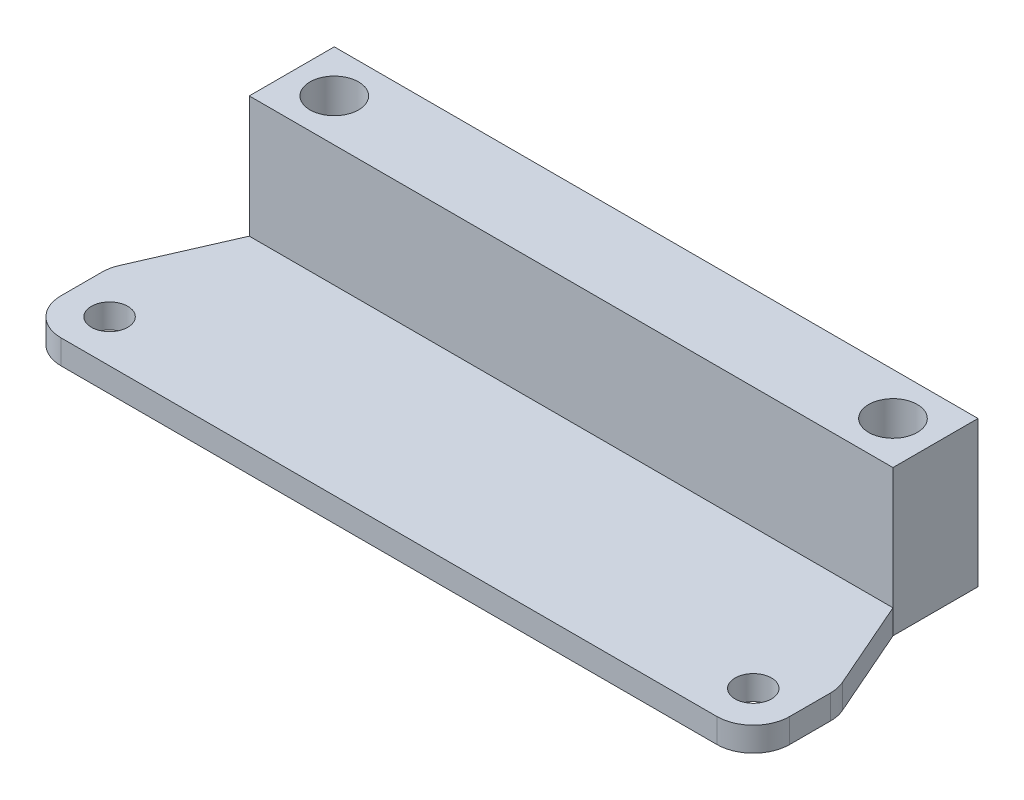
ISO-10303-21;
HEADER;
FILE_DESCRIPTION(('STEP AP214'),'2;1');
FILE_NAME('part.step','',(''),(''),'','','');
FILE_SCHEMA(('AUTOMOTIVE_DESIGN { 1 0 10303 214 1 1 1 1 }'));
ENDSEC;
DATA;
#1=APPLICATION_CONTEXT('core data for automotive mechanical design processes');
#2=APPLICATION_PROTOCOL_DEFINITION('international standard','automotive_design',2000,#1);
#3=PRODUCT_CONTEXT('',#1,'mechanical');
#4=PRODUCT('Part','Part','',(#3));
#5=PRODUCT_RELATED_PRODUCT_CATEGORY('part','',(#4));
#6=PRODUCT_DEFINITION_FORMATION('','',#4);
#7=PRODUCT_DEFINITION_CONTEXT('part definition',#1,'design');
#8=PRODUCT_DEFINITION('design','',#6,#7);
#9=PRODUCT_DEFINITION_SHAPE('','',#8);
#10=(LENGTH_UNIT() NAMED_UNIT(*) SI_UNIT(.MILLI.,.METRE.));
#11=(NAMED_UNIT(*) PLANE_ANGLE_UNIT() SI_UNIT($,.RADIAN.));
#12=(NAMED_UNIT(*) SI_UNIT($,.STERADIAN.) SOLID_ANGLE_UNIT());
#13=UNCERTAINTY_MEASURE_WITH_UNIT(LENGTH_MEASURE(1.E-05),#10,'distance_accuracy_value','');
#14=(GEOMETRIC_REPRESENTATION_CONTEXT(3) GLOBAL_UNCERTAINTY_ASSIGNED_CONTEXT((#13)) GLOBAL_UNIT_ASSIGNED_CONTEXT((#10,
#11,#12)) REPRESENTATION_CONTEXT('',''));
#15=CARTESIAN_POINT('',(0.,0.,0.));
#16=DIRECTION('',(0.,0.,1.));
#17=DIRECTION('',(1.,0.,0.));
#18=AXIS2_PLACEMENT_3D('',#15,#16,#17);
#19=CARTESIAN_POINT('',(3.49999999999999,2.,0.));
#20=DIRECTION('',(-1.,0.,0.));
#21=DIRECTION('',(0.,0.,1.));
#22=AXIS2_PLACEMENT_3D('',#19,#20,#21);
#23=PLANE('',#22);
#24=DIRECTION('',(0.,0.,-1.));
#25=VECTOR('',#24,1.);
#26=CARTESIAN_POINT('',(3.49999999999999,0.,0.));
#27=LINE('',#26,#25);
#28=CARTESIAN_POINT('',(3.5,0.,-15.));
#29=VERTEX_POINT('',#28);
#30=CARTESIAN_POINT('',(3.50000000000001,0.,-22.));
#31=VERTEX_POINT('',#30);
#32=EDGE_CURVE('E162',#29,#31,#27,.T.);
#33=ORIENTED_EDGE('',*,*,#32,.F.);
#34=DIRECTION('',(0.,-1.,0.));
#35=VECTOR('',#34,1.);
#36=CARTESIAN_POINT('',(3.5,2.,-15.));
#37=LINE('',#36,#35);
#38=CARTESIAN_POINT('',(3.5,2.,-15.));
#39=VERTEX_POINT('',#38);
#40=EDGE_CURVE('E11',#39,#29,#37,.T.);
#41=ORIENTED_EDGE('',*,*,#40,.F.);
#42=DIRECTION('',(0.,-1.,0.));
#43=VECTOR('',#42,1.);
#44=CARTESIAN_POINT('',(3.50000000000001,12.,-15.));
#45=LINE('',#44,#43);
#46=CARTESIAN_POINT('',(3.50000000000001,12.,-15.));
#47=VERTEX_POINT('',#46);
#48=EDGE_CURVE('E270',#47,#39,#45,.T.);
#49=ORIENTED_EDGE('',*,*,#48,.F.);
#50=DIRECTION('',(0.,0.,1.));
#51=VECTOR('',#50,1.);
#52=CARTESIAN_POINT('',(3.50000000000001,12.,-22.));
#53=LINE('',#52,#51);
#54=CARTESIAN_POINT('',(3.50000000000001,12.,-22.));
#55=VERTEX_POINT('',#54);
#56=EDGE_CURVE('E264',#55,#47,#53,.T.);
#57=ORIENTED_EDGE('',*,*,#56,.F.);
#58=DIRECTION('',(0.,-1.,0.));
#59=VECTOR('',#58,1.);
#60=CARTESIAN_POINT('',(3.50000000000001,2.,-22.));
#61=LINE('',#60,#59);
#62=EDGE_CURVE('E101',#55,#31,#61,.T.);
#63=ORIENTED_EDGE('',*,*,#62,.T.);
#64=EDGE_LOOP('',(#33,#41,#49,#57,#63));
#65=FACE_BOUND('',#64,.T.);
#66=ADVANCED_FACE('F36',(#65),#23,.T.);
#67=CARTESIAN_POINT('',(-2.57049180327869,2.,-1.12459016393443));
#68=DIRECTION('',(-0.916157334902189,0.,-0.400818834019708));
#69=DIRECTION('',(-0.400818834019708,0.,0.916157334902189));
#70=AXIS2_PLACEMENT_3D('',#67,#68,#69);
#71=PLANE('',#70);
#72=DIRECTION('',(0.400818834019708,0.,-0.916157334902189));
#73=VECTOR('',#72,1.);
#74=CARTESIAN_POINT('',(-2.57049180327869,0.,-1.12459016393443));
#75=LINE('',#74,#73);
#76=CARTESIAN_POINT('',(0.251527995293438,0.,-7.57492113209929));
#77=VERTEX_POINT('',#76);
#78=EDGE_CURVE('E164',#77,#29,#75,.T.);
#79=ORIENTED_EDGE('',*,*,#78,.F.);
#80=DIRECTION('',(0.,-1.,0.));
#81=VECTOR('',#80,1.);
#82=CARTESIAN_POINT('',(0.251527995293438,2.,-7.57492113209929));
#83=LINE('',#82,#81);
#84=CARTESIAN_POINT('',(0.251527995293438,2.,-7.57492113209929));
#85=VERTEX_POINT('',#84);
#86=EDGE_CURVE('E44',#85,#77,#83,.T.);
#87=ORIENTED_EDGE('',*,*,#86,.F.);
#88=DIRECTION('',(0.400818834019708,0.,-0.916157334902189));
#89=VECTOR('',#88,1.);
#90=CARTESIAN_POINT('',(-2.57049180327869,2.,-1.12459016393443));
#91=LINE('',#90,#89);
#92=EDGE_CURVE('E193',#85,#39,#91,.T.);
#93=ORIENTED_EDGE('',*,*,#92,.T.);
#94=ORIENTED_EDGE('',*,*,#40,.T.);
#95=EDGE_LOOP('',(#79,#87,#93,#94));
#96=FACE_BOUND('',#95,.T.);
#97=ADVANCED_FACE('F217',(#96),#71,.T.);
#98=CARTESIAN_POINT('',(3.,2.,-6.37246463004015));
#99=DIRECTION('',(0.,-1.,0.));
#100=DIRECTION('',(0.,0.,-1.));
#101=AXIS2_PLACEMENT_3D('',#98,#99,#100);
#102=CYLINDRICAL_SURFACE('',#101,3.);
#103=CARTESIAN_POINT('',(3.,0.,-6.37246463004015));
#104=DIRECTION('',(0.,1.,0.));
#105=DIRECTION('',(0.,0.,1.));
#106=AXIS2_PLACEMENT_3D('',#103,#104,#105);
#107=CIRCLE('',#106,3.);
#108=CARTESIAN_POINT('',(0.,0.,-6.37246463004014));
#109=VERTEX_POINT('',#108);
#110=EDGE_CURVE('E168',#109,#77,#107,.F.);
#111=ORIENTED_EDGE('',*,*,#110,.F.);
#112=DIRECTION('',(0.,-1.,0.));
#113=VECTOR('',#112,1.);
#114=CARTESIAN_POINT('',(0.,2.,-6.37246463004014));
#115=LINE('',#114,#113);
#116=CARTESIAN_POINT('',(0.,2.,-6.37246463004014));
#117=VERTEX_POINT('',#116);
#118=EDGE_CURVE('E207',#117,#109,#115,.T.);
#119=ORIENTED_EDGE('',*,*,#118,.F.);
#120=CARTESIAN_POINT('',(3.,2.,-6.37246463004015));
#121=DIRECTION('',(0.,1.,0.));
#122=DIRECTION('',(0.,0.,1.));
#123=AXIS2_PLACEMENT_3D('',#120,#121,#122);
#124=CIRCLE('',#123,3.);
#125=EDGE_CURVE('E214',#117,#85,#124,.F.);
#126=ORIENTED_EDGE('',*,*,#125,.T.);
#127=ORIENTED_EDGE('',*,*,#86,.T.);
#128=EDGE_LOOP('',(#111,#119,#126,#127));
#129=FACE_BOUND('',#128,.T.);
#130=ADVANCED_FACE('F212',(#129),#102,.T.);
#131=CARTESIAN_POINT('',(0.,2.,0.));
#132=DIRECTION('',(-1.,0.,0.));
#133=DIRECTION('',(0.,0.,1.));
#134=AXIS2_PLACEMENT_3D('',#131,#132,#133);
#135=PLANE('',#134);
#136=DIRECTION('',(0.,0.,-1.));
#137=VECTOR('',#136,1.);
#138=CARTESIAN_POINT('',(0.,0.,0.));
#139=LINE('',#138,#137);
#140=CARTESIAN_POINT('',(0.,0.,-3.00000000000002));
#141=VERTEX_POINT('',#140);
#142=EDGE_CURVE('E171',#141,#109,#139,.T.);
#143=ORIENTED_EDGE('',*,*,#142,.F.);
#144=DIRECTION('',(0.,-1.,0.));
#145=VECTOR('',#144,1.);
#146=CARTESIAN_POINT('',(0.,2.,-3.00000000000002));
#147=LINE('',#146,#145);
#148=CARTESIAN_POINT('',(0.,2.,-3.00000000000002));
#149=VERTEX_POINT('',#148);
#150=EDGE_CURVE('E205',#149,#141,#147,.T.);
#151=ORIENTED_EDGE('',*,*,#150,.F.);
#152=DIRECTION('',(0.,0.,-1.));
#153=VECTOR('',#152,1.);
#154=CARTESIAN_POINT('',(0.,2.,0.));
#155=LINE('',#154,#153);
#156=EDGE_CURVE('E228',#149,#117,#155,.T.);
#157=ORIENTED_EDGE('',*,*,#156,.T.);
#158=ORIENTED_EDGE('',*,*,#118,.T.);
#159=EDGE_LOOP('',(#143,#151,#157,#158));
#160=FACE_BOUND('',#159,.T.);
#161=ADVANCED_FACE('F224',(#160),#135,.T.);
#162=CARTESIAN_POINT('',(3.,2.,-3.));
#163=DIRECTION('',(0.,-1.,0.));
#164=DIRECTION('',(0.,0.,-1.));
#165=AXIS2_PLACEMENT_3D('',#162,#163,#164);
#166=CYLINDRICAL_SURFACE('',#165,3.);
#167=CARTESIAN_POINT('',(3.,0.,-3.));
#168=DIRECTION('',(0.,1.,0.));
#169=DIRECTION('',(0.,0.,1.));
#170=AXIS2_PLACEMENT_3D('',#167,#168,#169);
#171=CIRCLE('',#170,3.);
#172=CARTESIAN_POINT('',(3.00000000000002,0.,0.));
#173=VERTEX_POINT('',#172);
#174=EDGE_CURVE('E174',#141,#173,#171,.T.);
#175=ORIENTED_EDGE('',*,*,#174,.T.);
#176=DIRECTION('',(0.,-1.,0.));
#177=VECTOR('',#176,1.);
#178=CARTESIAN_POINT('',(3.00000000000002,2.,0.));
#179=LINE('',#178,#177);
#180=CARTESIAN_POINT('',(3.00000000000002,2.,0.));
#181=VERTEX_POINT('',#180);
#182=EDGE_CURVE('E202',#181,#173,#179,.T.);
#183=ORIENTED_EDGE('',*,*,#182,.F.);
#184=CARTESIAN_POINT('',(3.,2.,-3.));
#185=DIRECTION('',(0.,1.,0.));
#186=DIRECTION('',(0.,0.,1.));
#187=AXIS2_PLACEMENT_3D('',#184,#185,#186);
#188=CIRCLE('',#187,3.);
#189=EDGE_CURVE('E154',#149,#181,#188,.T.);
#190=ORIENTED_EDGE('',*,*,#189,.F.);
#191=ORIENTED_EDGE('',*,*,#150,.T.);
#192=EDGE_LOOP('',(#175,#183,#190,#191));
#193=FACE_BOUND('',#192,.T.);
#194=ADVANCED_FACE('F235',(#193),#166,.T.);
#195=CARTESIAN_POINT('',(0.,2.,0.));
#196=DIRECTION('',(0.,0.,-1.));
#197=DIRECTION('',(-1.,0.,0.));
#198=AXIS2_PLACEMENT_3D('',#195,#196,#197);
#199=PLANE('',#198);
#200=DIRECTION('',(1.,0.,0.));
#201=VECTOR('',#200,1.);
#202=CARTESIAN_POINT('',(0.,0.,0.));
#203=LINE('',#202,#201);
#204=CARTESIAN_POINT('',(57.,0.,0.));
#205=VERTEX_POINT('',#204);
#206=EDGE_CURVE('E176',#173,#205,#203,.T.);
#207=ORIENTED_EDGE('',*,*,#206,.T.);
#208=DIRECTION('',(0.,-1.,0.));
#209=VECTOR('',#208,1.);
#210=CARTESIAN_POINT('',(57.,2.,0.));
#211=LINE('',#210,#209);
#212=CARTESIAN_POINT('',(57.,2.,0.));
#213=VERTEX_POINT('',#212);
#214=EDGE_CURVE('E140',#213,#205,#211,.T.);
#215=ORIENTED_EDGE('',*,*,#214,.F.);
#216=DIRECTION('',(1.,0.,0.));
#217=VECTOR('',#216,1.);
#218=CARTESIAN_POINT('',(0.,2.,0.));
#219=LINE('',#218,#217);
#220=EDGE_CURVE('E151',#181,#213,#219,.T.);
#221=ORIENTED_EDGE('',*,*,#220,.F.);
#222=ORIENTED_EDGE('',*,*,#182,.T.);
#223=EDGE_LOOP('',(#207,#215,#221,#222));
#224=FACE_BOUND('',#223,.T.);
#225=ADVANCED_FACE('F237',(#224),#199,.F.);
#226=CARTESIAN_POINT('',(57.,2.,-3.));
#227=DIRECTION('',(0.,-1.,0.));
#228=DIRECTION('',(0.,0.,-1.));
#229=AXIS2_PLACEMENT_3D('',#226,#227,#228);
#230=CYLINDRICAL_SURFACE('',#229,3.);
#231=CARTESIAN_POINT('',(57.,0.,-3.));
#232=DIRECTION('',(0.,1.,0.));
#233=DIRECTION('',(0.,0.,1.));
#234=AXIS2_PLACEMENT_3D('',#231,#232,#233);
#235=CIRCLE('',#234,3.);
#236=CARTESIAN_POINT('',(60.,0.,-3.00000000000002));
#237=VERTEX_POINT('',#236);
#238=EDGE_CURVE('E137',#237,#205,#235,.F.);
#239=ORIENTED_EDGE('',*,*,#238,.F.);
#240=DIRECTION('',(0.,-1.,0.));
#241=VECTOR('',#240,1.);
#242=CARTESIAN_POINT('',(60.,2.,-3.00000000000002));
#243=LINE('',#242,#241);
#244=CARTESIAN_POINT('',(60.,2.,-3.00000000000002));
#245=VERTEX_POINT('',#244);
#246=EDGE_CURVE('E131',#245,#237,#243,.T.);
#247=ORIENTED_EDGE('',*,*,#246,.F.);
#248=CARTESIAN_POINT('',(57.,2.,-3.));
#249=DIRECTION('',(0.,1.,0.));
#250=DIRECTION('',(0.,0.,1.));
#251=AXIS2_PLACEMENT_3D('',#248,#249,#250);
#252=CIRCLE('',#251,3.);
#253=EDGE_CURVE('E135',#245,#213,#252,.F.);
#254=ORIENTED_EDGE('',*,*,#253,.T.);
#255=ORIENTED_EDGE('',*,*,#214,.T.);
#256=EDGE_LOOP('',(#239,#247,#254,#255));
#257=FACE_BOUND('',#256,.T.);
#258=ADVANCED_FACE('F133',(#257),#230,.T.);
#259=CARTESIAN_POINT('',(60.,2.,0.));
#260=DIRECTION('',(-1.,0.,0.));
#261=DIRECTION('',(0.,0.,1.));
#262=AXIS2_PLACEMENT_3D('',#259,#260,#261);
#263=PLANE('',#262);
#264=DIRECTION('',(0.,0.,-1.));
#265=VECTOR('',#264,1.);
#266=CARTESIAN_POINT('',(60.,0.,0.));
#267=LINE('',#266,#265);
#268=CARTESIAN_POINT('',(60.,0.,-6.37246463004014));
#269=VERTEX_POINT('',#268);
#270=EDGE_CURVE('E180',#237,#269,#267,.T.);
#271=ORIENTED_EDGE('',*,*,#270,.T.);
#272=DIRECTION('',(0.,-1.,0.));
#273=VECTOR('',#272,1.);
#274=CARTESIAN_POINT('',(60.,2.,-6.37246463004014));
#275=LINE('',#274,#273);
#276=CARTESIAN_POINT('',(60.,2.,-6.37246463004014));
#277=VERTEX_POINT('',#276);
#278=EDGE_CURVE('E141',#277,#269,#275,.T.);
#279=ORIENTED_EDGE('',*,*,#278,.F.);
#280=DIRECTION('',(0.,0.,-1.));
#281=VECTOR('',#280,1.);
#282=CARTESIAN_POINT('',(60.,2.,0.));
#283=LINE('',#282,#281);
#284=EDGE_CURVE('E144',#245,#277,#283,.T.);
#285=ORIENTED_EDGE('',*,*,#284,.F.);
#286=ORIENTED_EDGE('',*,*,#246,.T.);
#287=EDGE_LOOP('',(#271,#279,#285,#286));
#288=FACE_BOUND('',#287,.T.);
#289=ADVANCED_FACE('F145',(#288),#263,.F.);
#290=CARTESIAN_POINT('',(57.,2.,-6.37246463004015));
#291=DIRECTION('',(0.,-1.,0.));
#292=DIRECTION('',(0.,0.,-1.));
#293=AXIS2_PLACEMENT_3D('',#290,#291,#292);
#294=CYLINDRICAL_SURFACE('',#293,3.);
#295=CARTESIAN_POINT('',(57.,0.,-6.37246463004015));
#296=DIRECTION('',(0.,1.,0.));
#297=DIRECTION('',(0.,0.,1.));
#298=AXIS2_PLACEMENT_3D('',#295,#296,#297);
#299=CIRCLE('',#298,3.);
#300=CARTESIAN_POINT('',(59.7484720047066,0.,-7.57492113209929));
#301=VERTEX_POINT('',#300);
#302=EDGE_CURVE('E182',#269,#301,#299,.T.);
#303=ORIENTED_EDGE('',*,*,#302,.T.);
#304=DIRECTION('',(0.,-1.,0.));
#305=VECTOR('',#304,1.);
#306=CARTESIAN_POINT('',(59.7484720047066,2.,-7.57492113209929));
#307=LINE('',#306,#305);
#308=CARTESIAN_POINT('',(59.7484720047066,2.,-7.57492113209929));
#309=VERTEX_POINT('',#308);
#310=EDGE_CURVE('E198',#309,#301,#307,.T.);
#311=ORIENTED_EDGE('',*,*,#310,.F.);
#312=CARTESIAN_POINT('',(57.,2.,-6.37246463004015));
#313=DIRECTION('',(0.,1.,0.));
#314=DIRECTION('',(0.,0.,1.));
#315=AXIS2_PLACEMENT_3D('',#312,#313,#314);
#316=CIRCLE('',#315,3.);
#317=EDGE_CURVE('E52',#277,#309,#316,.T.);
#318=ORIENTED_EDGE('',*,*,#317,.F.);
#319=ORIENTED_EDGE('',*,*,#278,.T.);
#320=EDGE_LOOP('',(#303,#311,#318,#319));
#321=FACE_BOUND('',#320,.T.);
#322=ADVANCED_FACE('F240',(#321),#294,.T.);
#323=CARTESIAN_POINT('',(52.9311475409836,2.,-23.1573770491803));
#324=DIRECTION('',(0.916157334902189,0.,-0.400818834019707));
#325=DIRECTION('',(-0.400818834019707,0.,-0.916157334902189));
#326=AXIS2_PLACEMENT_3D('',#323,#324,#325);
#327=PLANE('',#326);
#328=DIRECTION('',(0.400818834019707,0.,0.916157334902189));
#329=VECTOR('',#328,1.);
#330=CARTESIAN_POINT('',(52.9311475409836,0.,-23.1573770491803));
#331=LINE('',#330,#329);
#332=CARTESIAN_POINT('',(56.5,0.,-15.));
#333=VERTEX_POINT('',#332);
#334=EDGE_CURVE('E185',#333,#301,#331,.T.);
#335=ORIENTED_EDGE('',*,*,#334,.F.);
#336=DIRECTION('',(0.,-1.,0.));
#337=VECTOR('',#336,1.);
#338=CARTESIAN_POINT('',(56.5,2.,-15.));
#339=LINE('',#338,#337);
#340=CARTESIAN_POINT('',(56.5,2.,-15.));
#341=VERTEX_POINT('',#340);
#342=EDGE_CURVE('E196',#341,#333,#339,.T.);
#343=ORIENTED_EDGE('',*,*,#342,.F.);
#344=DIRECTION('',(0.400818834019707,0.,0.916157334902189));
#345=VECTOR('',#344,1.);
#346=CARTESIAN_POINT('',(52.9311475409836,2.,-23.1573770491803));
#347=LINE('',#346,#345);
#348=EDGE_CURVE('E159',#341,#309,#347,.T.);
#349=ORIENTED_EDGE('',*,*,#348,.T.);
#350=ORIENTED_EDGE('',*,*,#310,.T.);
#351=EDGE_LOOP('',(#335,#343,#349,#350));
#352=FACE_BOUND('',#351,.T.);
#353=ADVANCED_FACE('F244',(#352),#327,.T.);
#354=CARTESIAN_POINT('',(56.5,2.,-1.12013573020217E-13));
#355=DIRECTION('',(-1.,0.,0.));
#356=DIRECTION('',(0.,0.,1.));
#357=AXIS2_PLACEMENT_3D('',#354,#355,#356);
#358=PLANE('',#357);
#359=DIRECTION('',(0.,0.,-1.));
#360=VECTOR('',#359,1.);
#361=CARTESIAN_POINT('',(56.5,0.,-1.12013573020217E-13));
#362=LINE('',#361,#360);
#363=CARTESIAN_POINT('',(56.5,0.,-22.));
#364=VERTEX_POINT('',#363);
#365=EDGE_CURVE('E188',#333,#364,#362,.T.);
#366=ORIENTED_EDGE('',*,*,#365,.T.);
#367=DIRECTION('',(0.,-1.,0.));
#368=VECTOR('',#367,1.);
#369=CARTESIAN_POINT('',(56.5,2.,-22.));
#370=LINE('',#369,#368);
#371=CARTESIAN_POINT('',(56.5,12.,-22.));
#372=VERTEX_POINT('',#371);
#373=EDGE_CURVE('E93',#372,#364,#370,.T.);
#374=ORIENTED_EDGE('',*,*,#373,.F.);
#375=DIRECTION('',(0.,0.,-1.));
#376=VECTOR('',#375,1.);
#377=CARTESIAN_POINT('',(56.5,12.,-22.));
#378=LINE('',#377,#376);
#379=CARTESIAN_POINT('',(56.5,12.,-15.));
#380=VERTEX_POINT('',#379);
#381=EDGE_CURVE('E267',#380,#372,#378,.T.);
#382=ORIENTED_EDGE('',*,*,#381,.F.);
#383=DIRECTION('',(0.,-1.,0.));
#384=VECTOR('',#383,1.);
#385=CARTESIAN_POINT('',(56.5,12.,-15.));
#386=LINE('',#385,#384);
#387=EDGE_CURVE('E268',#380,#341,#386,.T.);
#388=ORIENTED_EDGE('',*,*,#387,.T.);
#389=ORIENTED_EDGE('',*,*,#342,.T.);
#390=EDGE_LOOP('',(#366,#374,#382,#388,#389));
#391=FACE_BOUND('',#390,.T.);
#392=ADVANCED_FACE('F304',(#391),#358,.F.);
#393=CARTESIAN_POINT('',(0.,2.,-22.));
#394=DIRECTION('',(0.,0.,-1.));
#395=DIRECTION('',(-1.,0.,0.));
#396=AXIS2_PLACEMENT_3D('',#393,#394,#395);
#397=PLANE('',#396);
#398=DIRECTION('',(1.,0.,0.));
#399=VECTOR('',#398,1.);
#400=CARTESIAN_POINT('',(0.,0.,-22.));
#401=LINE('',#400,#399);
#402=EDGE_CURVE('E190',#31,#364,#401,.T.);
#403=ORIENTED_EDGE('',*,*,#402,.F.);
#404=ORIENTED_EDGE('',*,*,#62,.F.);
#405=DIRECTION('',(-1.,0.,0.));
#406=VECTOR('',#405,1.);
#407=CARTESIAN_POINT('',(3.50000000000001,12.,-22.));
#408=LINE('',#407,#406);
#409=EDGE_CURVE('E260',#372,#55,#408,.T.);
#410=ORIENTED_EDGE('',*,*,#409,.F.);
#411=ORIENTED_EDGE('',*,*,#373,.T.);
#412=EDGE_LOOP('',(#403,#404,#410,#411));
#413=FACE_BOUND('',#412,.T.);
#414=ADVANCED_FACE('F259',(#413),#397,.T.);
#415=CARTESIAN_POINT('',(0.,2.,0.));
#416=DIRECTION('',(0.,1.,0.));
#417=DIRECTION('',(0.,0.,1.));
#418=AXIS2_PLACEMENT_3D('',#415,#416,#417);
#419=PLANE('',#418);
#420=DIRECTION('',(1.,0.,0.));
#421=VECTOR('',#420,1.);
#422=CARTESIAN_POINT('',(3.50000000000001,2.,-15.));
#423=LINE('',#422,#421);
#424=EDGE_CURVE('E108',#39,#341,#423,.T.);
#425=ORIENTED_EDGE('',*,*,#424,.F.);
#426=ORIENTED_EDGE('',*,*,#92,.F.);
#427=ORIENTED_EDGE('',*,*,#125,.F.);
#428=ORIENTED_EDGE('',*,*,#156,.F.);
#429=ORIENTED_EDGE('',*,*,#189,.T.);
#430=ORIENTED_EDGE('',*,*,#220,.T.);
#431=ORIENTED_EDGE('',*,*,#253,.F.);
#432=ORIENTED_EDGE('',*,*,#284,.T.);
#433=ORIENTED_EDGE('',*,*,#317,.T.);
#434=ORIENTED_EDGE('',*,*,#348,.F.);
#435=EDGE_LOOP('',(#425,#426,#427,#428,#429,#430,#431,#432,#433,#434));
#436=FACE_BOUND('',#435,.T.);
#437=CARTESIAN_POINT('',(3.5,2.,-3.5));
#438=DIRECTION('',(0.,1.,0.));
#439=DIRECTION('',(0.,0.,1.));
#440=AXIS2_PLACEMENT_3D('',#437,#438,#439);
#441=CIRCLE('',#440,1.5);
#442=CARTESIAN_POINT('',(3.5,2.,-2.));
#443=VERTEX_POINT('',#442);
#444=EDGE_CURVE('E286',#443,#443,#441,.T.);
#445=ORIENTED_EDGE('',*,*,#444,.F.);
#446=EDGE_LOOP('',(#445));
#447=FACE_BOUND('',#446,.T.);
#448=CARTESIAN_POINT('',(56.5,2.,-3.5));
#449=DIRECTION('',(0.,1.,0.));
#450=DIRECTION('',(0.,0.,1.));
#451=AXIS2_PLACEMENT_3D('',#448,#449,#450);
#452=CIRCLE('',#451,1.5);
#453=CARTESIAN_POINT('',(56.5,2.,-2.));
#454=VERTEX_POINT('',#453);
#455=EDGE_CURVE('E283',#454,#454,#452,.T.);
#456=ORIENTED_EDGE('',*,*,#455,.F.);
#457=EDGE_LOOP('',(#456));
#458=FACE_BOUND('',#457,.T.);
#459=ADVANCED_FACE('F148',(#436,#447,#458),#419,.T.);
#460=CARTESIAN_POINT('',(0.,0.,0.));
#461=DIRECTION('',(0.,1.,0.));
#462=DIRECTION('',(0.,0.,1.));
#463=AXIS2_PLACEMENT_3D('',#460,#461,#462);
#464=PLANE('',#463);
#465=CARTESIAN_POINT('',(3.5,0.,-3.5));
#466=DIRECTION('',(0.,1.,0.));
#467=DIRECTION('',(0.,0.,1.));
#468=AXIS2_PLACEMENT_3D('',#465,#466,#467);
#469=CIRCLE('',#468,1.5);
#470=CARTESIAN_POINT('',(3.5,0.,-2.));
#471=VERTEX_POINT('',#470);
#472=EDGE_CURVE('E165',#471,#471,#469,.T.);
#473=ORIENTED_EDGE('',*,*,#472,.T.);
#474=EDGE_LOOP('',(#473));
#475=FACE_BOUND('',#474,.T.);
#476=CARTESIAN_POINT('',(56.5,0.,-3.5));
#477=DIRECTION('',(0.,1.,0.));
#478=DIRECTION('',(0.,0.,1.));
#479=AXIS2_PLACEMENT_3D('',#476,#477,#478);
#480=CIRCLE('',#479,1.5);
#481=CARTESIAN_POINT('',(56.5,0.,-2.));
#482=VERTEX_POINT('',#481);
#483=EDGE_CURVE('E289',#482,#482,#480,.T.);
#484=ORIENTED_EDGE('',*,*,#483,.T.);
#485=EDGE_LOOP('',(#484));
#486=FACE_BOUND('',#485,.T.);
#487=ORIENTED_EDGE('',*,*,#32,.T.);
#488=ORIENTED_EDGE('',*,*,#402,.T.);
#489=ORIENTED_EDGE('',*,*,#365,.F.);
#490=ORIENTED_EDGE('',*,*,#334,.T.);
#491=ORIENTED_EDGE('',*,*,#302,.F.);
#492=ORIENTED_EDGE('',*,*,#270,.F.);
#493=ORIENTED_EDGE('',*,*,#238,.T.);
#494=ORIENTED_EDGE('',*,*,#206,.F.);
#495=ORIENTED_EDGE('',*,*,#174,.F.);
#496=ORIENTED_EDGE('',*,*,#142,.T.);
#497=ORIENTED_EDGE('',*,*,#110,.T.);
#498=ORIENTED_EDGE('',*,*,#78,.T.);
#499=EDGE_LOOP('',(#487,#488,#489,#490,#491,#492,#493,#494,#495,#496,#497,#498));
#500=FACE_BOUND('',#499,.T.);
#501=ADVANCED_FACE('F219',(#475,#486,#500),#464,.F.);
#502=CARTESIAN_POINT('',(56.5,0.,-3.5));
#503=DIRECTION('',(0.,1.,0.));
#504=DIRECTION('',(0.,0.,1.));
#505=AXIS2_PLACEMENT_3D('',#502,#503,#504);
#506=CYLINDRICAL_SURFACE('',#505,1.5);
#507=ORIENTED_EDGE('',*,*,#483,.F.);
#508=EDGE_LOOP('',(#507));
#509=FACE_BOUND('',#508,.T.);
#510=ORIENTED_EDGE('',*,*,#455,.T.);
#511=EDGE_LOOP('',(#510));
#512=FACE_BOUND('',#511,.T.);
#513=ADVANCED_FACE('F294',(#509,#512),#506,.F.);
#514=CARTESIAN_POINT('',(3.5,0.,-3.5));
#515=DIRECTION('',(0.,1.,0.));
#516=DIRECTION('',(0.,0.,1.));
#517=AXIS2_PLACEMENT_3D('',#514,#515,#516);
#518=CYLINDRICAL_SURFACE('',#517,1.5);
#519=ORIENTED_EDGE('',*,*,#472,.F.);
#520=EDGE_LOOP('',(#519));
#521=FACE_BOUND('',#520,.T.);
#522=ORIENTED_EDGE('',*,*,#444,.T.);
#523=EDGE_LOOP('',(#522));
#524=FACE_BOUND('',#523,.T.);
#525=ADVANCED_FACE('F337',(#521,#524),#518,.F.);
#526=CARTESIAN_POINT('',(3.50000000000001,12.,-15.));
#527=DIRECTION('',(0.,0.,-1.));
#528=DIRECTION('',(-1.,0.,0.));
#529=AXIS2_PLACEMENT_3D('',#526,#527,#528);
#530=PLANE('',#529);
#531=ORIENTED_EDGE('',*,*,#424,.T.);
#532=ORIENTED_EDGE('',*,*,#387,.F.);
#533=DIRECTION('',(1.,0.,0.));
#534=VECTOR('',#533,1.);
#535=CARTESIAN_POINT('',(3.50000000000001,12.,-15.));
#536=LINE('',#535,#534);
#537=EDGE_CURVE('E253',#47,#380,#536,.T.);
#538=ORIENTED_EDGE('',*,*,#537,.F.);
#539=ORIENTED_EDGE('',*,*,#48,.T.);
#540=EDGE_LOOP('',(#531,#532,#538,#539));
#541=FACE_BOUND('',#540,.T.);
#542=ADVANCED_FACE('F335',(#541),#530,.F.);
#543=CARTESIAN_POINT('',(0.,12.,0.));
#544=DIRECTION('',(0.,1.,0.));
#545=DIRECTION('',(0.,0.,1.));
#546=AXIS2_PLACEMENT_3D('',#543,#544,#545);
#547=PLANE('',#546);
#548=CARTESIAN_POINT('',(7.00000000000001,12.,-18.5));
#549=DIRECTION('',(0.,1.,0.));
#550=DIRECTION('',(0.,0.,1.));
#551=AXIS2_PLACEMENT_3D('',#548,#549,#550);
#552=CIRCLE('',#551,2.);
#553=CARTESIAN_POINT('',(7.00000000000001,12.,-16.5));
#554=VERTEX_POINT('',#553);
#555=EDGE_CURVE('E443',#554,#554,#552,.T.);
#556=ORIENTED_EDGE('',*,*,#555,.F.);
#557=EDGE_LOOP('',(#556));
#558=FACE_BOUND('',#557,.T.);
#559=CARTESIAN_POINT('',(53.,12.,-18.5));
#560=DIRECTION('',(0.,1.,0.));
#561=DIRECTION('',(0.,0.,1.));
#562=AXIS2_PLACEMENT_3D('',#559,#560,#561);
#563=CIRCLE('',#562,2.);
#564=CARTESIAN_POINT('',(53.,12.,-16.5));
#565=VERTEX_POINT('',#564);
#566=EDGE_CURVE('E276',#565,#565,#563,.T.);
#567=ORIENTED_EDGE('',*,*,#566,.F.);
#568=EDGE_LOOP('',(#567));
#569=FACE_BOUND('',#568,.T.);
#570=ORIENTED_EDGE('',*,*,#56,.T.);
#571=ORIENTED_EDGE('',*,*,#537,.T.);
#572=ORIENTED_EDGE('',*,*,#381,.T.);
#573=ORIENTED_EDGE('',*,*,#409,.T.);
#574=EDGE_LOOP('',(#570,#571,#572,#573));
#575=FACE_BOUND('',#574,.T.);
#576=ADVANCED_FACE('F263',(#558,#569,#575),#547,.T.);
#577=CARTESIAN_POINT('',(53.,8.5,-18.5));
#578=DIRECTION('',(0.,1.,0.));
#579=DIRECTION('',(0.,0.,1.));
#580=AXIS2_PLACEMENT_3D('',#577,#578,#579);
#581=CYLINDRICAL_SURFACE('',#580,2.);
#582=CARTESIAN_POINT('',(53.,8.5,-18.5));
#583=DIRECTION('',(0.,1.,0.));
#584=DIRECTION('',(0.,0.,1.));
#585=AXIS2_PLACEMENT_3D('',#582,#583,#584);
#586=CIRCLE('',#585,2.);
#587=CARTESIAN_POINT('',(53.,8.5,-16.5));
#588=VERTEX_POINT('',#587);
#589=EDGE_CURVE('E446',#588,#588,#586,.T.);
#590=ORIENTED_EDGE('',*,*,#589,.F.);
#591=EDGE_LOOP('',(#590));
#592=FACE_BOUND('',#591,.T.);
#593=ORIENTED_EDGE('',*,*,#566,.T.);
#594=EDGE_LOOP('',(#593));
#595=FACE_BOUND('',#594,.T.);
#596=ADVANCED_FACE('F343',(#592,#595),#581,.F.);
#597=CARTESIAN_POINT('',(53.,8.5,-18.5));
#598=DIRECTION('',(0.,1.,0.));
#599=DIRECTION('',(0.,0.,1.));
#600=AXIS2_PLACEMENT_3D('',#597,#598,#599);
#601=PLANE('',#600);
#602=ORIENTED_EDGE('',*,*,#589,.T.);
#603=EDGE_LOOP('',(#602));
#604=FACE_BOUND('',#603,.T.);
#605=ADVANCED_FACE('F408',(#604),#601,.T.);
#606=CARTESIAN_POINT('',(7.00000000000001,8.5,-18.5));
#607=DIRECTION('',(0.,1.,0.));
#608=DIRECTION('',(0.,0.,1.));
#609=AXIS2_PLACEMENT_3D('',#606,#607,#608);
#610=CYLINDRICAL_SURFACE('',#609,2.);
#611=CARTESIAN_POINT('',(7.00000000000001,8.5,-18.5));
#612=DIRECTION('',(0.,1.,0.));
#613=DIRECTION('',(0.,0.,1.));
#614=AXIS2_PLACEMENT_3D('',#611,#612,#613);
#615=CIRCLE('',#614,2.);
#616=CARTESIAN_POINT('',(7.00000000000001,8.5,-16.5));
#617=VERTEX_POINT('',#616);
#618=EDGE_CURVE('E273',#617,#617,#615,.T.);
#619=ORIENTED_EDGE('',*,*,#618,.F.);
#620=EDGE_LOOP('',(#619));
#621=FACE_BOUND('',#620,.T.);
#622=ORIENTED_EDGE('',*,*,#555,.T.);
#623=EDGE_LOOP('',(#622));
#624=FACE_BOUND('',#623,.T.);
#625=ADVANCED_FACE('F417',(#621,#624),#610,.F.);
#626=CARTESIAN_POINT('',(7.00000000000001,8.5,-18.5));
#627=DIRECTION('',(0.,1.,0.));
#628=DIRECTION('',(0.,0.,1.));
#629=AXIS2_PLACEMENT_3D('',#626,#627,#628);
#630=PLANE('',#629);
#631=ORIENTED_EDGE('',*,*,#618,.T.);
#632=EDGE_LOOP('',(#631));
#633=FACE_BOUND('',#632,.T.);
#634=ADVANCED_FACE('F427',(#633),#630,.T.);
#635=CLOSED_SHELL('',(#66,#97,#130,#161,#194,#225,#258,#289,#322,#353,#392,#414,#459,#501,#513,
#525,#542,#576,#596,#605,#625,#634));
#636=MANIFOLD_SOLID_BREP('B2',#635);
#637=ADVANCED_BREP_SHAPE_REPRESENTATION('',(#18,#636),#14);
#638=SHAPE_DEFINITION_REPRESENTATION(#9,#637);
ENDSEC;
END-ISO-10303-21;
